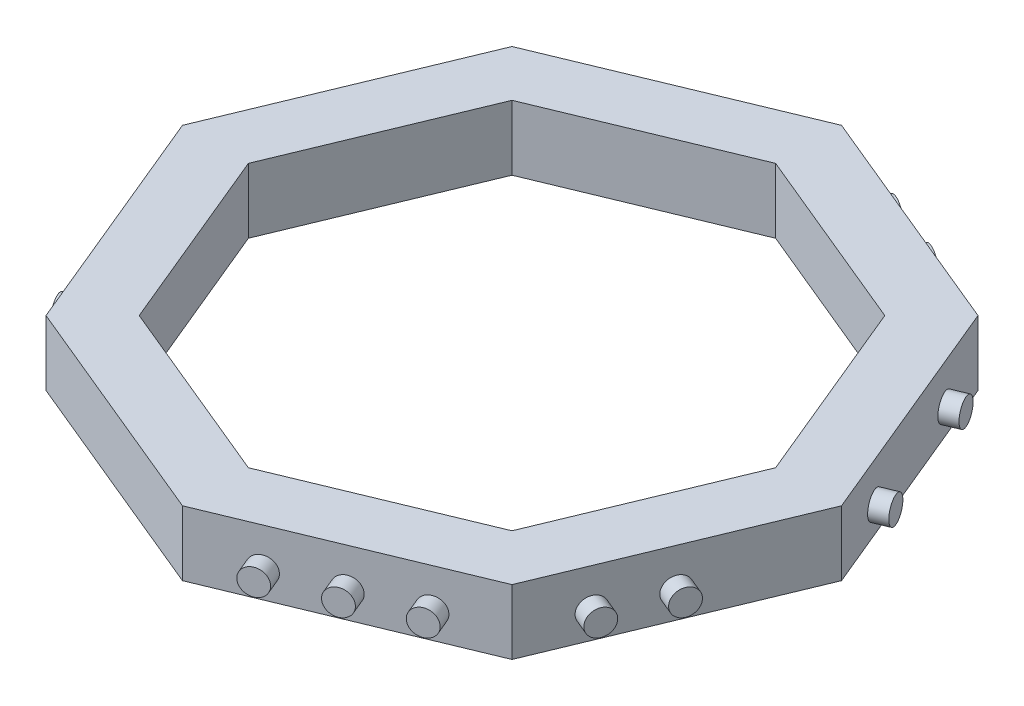
ISO-10303-21;
HEADER;
FILE_DESCRIPTION(('STEP AP214'),'2;1');
FILE_NAME('part.step','',(''),(''),'','','');
FILE_SCHEMA(('AUTOMOTIVE_DESIGN { 1 0 10303 214 1 1 1 1 }'));
ENDSEC;
DATA;
#1=APPLICATION_CONTEXT('core data for automotive mechanical design processes');
#2=APPLICATION_PROTOCOL_DEFINITION('international standard','automotive_design',2000,#1);
#3=PRODUCT_CONTEXT('',#1,'mechanical');
#4=PRODUCT('Part','Part','',(#3));
#5=PRODUCT_RELATED_PRODUCT_CATEGORY('part','',(#4));
#6=PRODUCT_DEFINITION_FORMATION('','',#4);
#7=PRODUCT_DEFINITION_CONTEXT('part definition',#1,'design');
#8=PRODUCT_DEFINITION('design','',#6,#7);
#9=PRODUCT_DEFINITION_SHAPE('','',#8);
#10=(LENGTH_UNIT() NAMED_UNIT(*) SI_UNIT(.MILLI.,.METRE.));
#11=(NAMED_UNIT(*) PLANE_ANGLE_UNIT() SI_UNIT($,.RADIAN.));
#12=(NAMED_UNIT(*) SI_UNIT($,.STERADIAN.) SOLID_ANGLE_UNIT());
#13=UNCERTAINTY_MEASURE_WITH_UNIT(LENGTH_MEASURE(1.E-05),#10,'distance_accuracy_value','');
#14=(GEOMETRIC_REPRESENTATION_CONTEXT(3) GLOBAL_UNCERTAINTY_ASSIGNED_CONTEXT((#13)) GLOBAL_UNIT_ASSIGNED_CONTEXT((#10,
#11,#12)) REPRESENTATION_CONTEXT('',''));
#15=CARTESIAN_POINT('',(0.,0.,0.));
#16=DIRECTION('',(0.,0.,1.));
#17=DIRECTION('',(1.,0.,0.));
#18=AXIS2_PLACEMENT_3D('',#15,#16,#17);
#19=CARTESIAN_POINT('',(17.9605122421385,5.,17.9605122421381));
#20=DIRECTION('',(-0.923879532511291,0.,-0.38268343236508));
#21=DIRECTION('',(-0.38268343236508,0.,0.923879532511291));
#22=AXIS2_PLACEMENT_3D('',#19,#20,#21);
#23=PLANE('',#22);
#24=CARTESIAN_POINT('',(21.6802561210693,2.,8.98025612106892));
#25=DIRECTION('',(-0.923879532511291,0.,-0.38268343236508));
#26=DIRECTION('',(-0.38268343236508,0.,0.923879532511291));
#27=AXIS2_PLACEMENT_3D('',#24,#25,#26);
#28=CIRCLE('',#27,1.);
#29=CARTESIAN_POINT('',(21.2975726887042,2.,9.90413565358022));
#30=VERTEX_POINT('',#29);
#31=EDGE_CURVE('E11',#30,#30,#28,.F.);
#32=ORIENTED_EDGE('',*,*,#31,.F.);
#33=EDGE_LOOP('',(#32));
#34=FACE_BOUND('',#33,.T.);
#35=CARTESIAN_POINT('',(19.7668389592439,2.,13.5996537836254));
#36=DIRECTION('',(-0.923879532511291,0.,-0.38268343236508));
#37=DIRECTION('',(-0.38268343236508,0.,0.923879532511291));
#38=AXIS2_PLACEMENT_3D('',#35,#36,#37);
#39=CIRCLE('',#38,1.);
#40=CARTESIAN_POINT('',(19.3841555268788,2.,14.5235333161367));
#41=VERTEX_POINT('',#40);
#42=EDGE_CURVE('E40',#41,#41,#39,.F.);
#43=ORIENTED_EDGE('',*,*,#42,.F.);
#44=EDGE_LOOP('',(#43));
#45=FACE_BOUND('',#44,.T.);
#46=DIRECTION('',(0.38268343236508,0.,-0.923879532511291));
#47=VECTOR('',#46,1.);
#48=CARTESIAN_POINT('',(17.9605122421385,0.,17.9605122421381));
#49=LINE('',#48,#47);
#50=CARTESIAN_POINT('',(17.9605122421385,0.,17.9605122421381));
#51=VERTEX_POINT('',#50);
#52=CARTESIAN_POINT('',(25.4,0.,-2.74086309204336E-13));
#53=VERTEX_POINT('',#52);
#54=EDGE_CURVE('E205',#51,#53,#49,.T.);
#55=ORIENTED_EDGE('',*,*,#54,.T.);
#56=DIRECTION('',(0.,-1.,0.));
#57=VECTOR('',#56,1.);
#58=CARTESIAN_POINT('',(25.4,5.,-2.74086309204336E-13));
#59=LINE('',#58,#57);
#60=CARTESIAN_POINT('',(25.4,5.,-2.74086309204336E-13));
#61=VERTEX_POINT('',#60);
#62=EDGE_CURVE('E271',#61,#53,#59,.T.);
#63=ORIENTED_EDGE('',*,*,#62,.F.);
#64=DIRECTION('',(0.38268343236508,0.,-0.923879532511291));
#65=VECTOR('',#64,1.);
#66=CARTESIAN_POINT('',(17.9605122421385,5.,17.9605122421381));
#67=LINE('',#66,#65);
#68=CARTESIAN_POINT('',(17.9605122421385,5.,17.9605122421381));
#69=VERTEX_POINT('',#68);
#70=EDGE_CURVE('E217',#69,#61,#67,.T.);
#71=ORIENTED_EDGE('',*,*,#70,.F.);
#72=DIRECTION('',(0.,-1.,0.));
#73=VECTOR('',#72,1.);
#74=CARTESIAN_POINT('',(17.9605122421385,5.,17.9605122421381));
#75=LINE('',#74,#73);
#76=EDGE_CURVE('E235',#69,#51,#75,.T.);
#77=ORIENTED_EDGE('',*,*,#76,.T.);
#78=EDGE_LOOP('',(#55,#63,#71,#77));
#79=FACE_BOUND('',#78,.T.);
#80=ADVANCED_FACE('F33',(#34,#45,#79),#23,.F.);
#81=CARTESIAN_POINT('',(25.4,5.,-2.74086309204336E-13));
#82=DIRECTION('',(-0.923879532511283,0.,0.3826834323651));
#83=DIRECTION('',(0.3826834323651,0.,0.923879532511283));
#84=AXIS2_PLACEMENT_3D('',#81,#82,#83);
#85=PLANE('',#84);
#86=CARTESIAN_POINT('',(19.7668389592436,2.,-13.5996537836258));
#87=DIRECTION('',(-0.923879532511283,0.,0.3826834323651));
#88=DIRECTION('',(0.3826834323651,0.,0.923879532511283));
#89=AXIS2_PLACEMENT_3D('',#86,#87,#88);
#90=CIRCLE('',#89,1.);
#91=CARTESIAN_POINT('',(20.1495223916087,2.,-12.6757742511145));
#92=VERTEX_POINT('',#91);
#93=EDGE_CURVE('E301',#92,#92,#90,.F.);
#94=ORIENTED_EDGE('',*,*,#93,.F.);
#95=EDGE_LOOP('',(#94));
#96=FACE_BOUND('',#95,.T.);
#97=CARTESIAN_POINT('',(23.5936732828946,2.,-4.36085845851299));
#98=DIRECTION('',(-0.923879532511283,0.,0.3826834323651));
#99=DIRECTION('',(0.3826834323651,0.,0.923879532511283));
#100=AXIS2_PLACEMENT_3D('',#97,#98,#99);
#101=CIRCLE('',#100,1.);
#102=CARTESIAN_POINT('',(23.9763567152597,2.,-3.43697892600171));
#103=VERTEX_POINT('',#102);
#104=EDGE_CURVE('E298',#103,#103,#101,.F.);
#105=ORIENTED_EDGE('',*,*,#104,.F.);
#106=EDGE_LOOP('',(#105));
#107=FACE_BOUND('',#106,.T.);
#108=DIRECTION('',(-0.3826834323651,0.,-0.923879532511283));
#109=VECTOR('',#108,1.);
#110=CARTESIAN_POINT('',(25.4,0.,-2.74086309204336E-13));
#111=LINE('',#110,#109);
#112=CARTESIAN_POINT('',(17.9605122421381,0.,-17.9605122421385));
#113=VERTEX_POINT('',#112);
#114=EDGE_CURVE('E238',#53,#113,#111,.T.);
#115=ORIENTED_EDGE('',*,*,#114,.T.);
#116=DIRECTION('',(0.,-1.,0.));
#117=VECTOR('',#116,1.);
#118=CARTESIAN_POINT('',(17.9605122421381,5.,-17.9605122421385));
#119=LINE('',#118,#117);
#120=CARTESIAN_POINT('',(17.9605122421381,5.,-17.9605122421385));
#121=VERTEX_POINT('',#120);
#122=EDGE_CURVE('E268',#121,#113,#119,.T.);
#123=ORIENTED_EDGE('',*,*,#122,.F.);
#124=DIRECTION('',(-0.3826834323651,0.,-0.923879532511283));
#125=VECTOR('',#124,1.);
#126=CARTESIAN_POINT('',(25.4,5.,-2.74086309204336E-13));
#127=LINE('',#126,#125);
#128=EDGE_CURVE('E220',#61,#121,#127,.T.);
#129=ORIENTED_EDGE('',*,*,#128,.F.);
#130=ORIENTED_EDGE('',*,*,#62,.T.);
#131=EDGE_LOOP('',(#115,#123,#129,#130));
#132=FACE_BOUND('',#131,.T.);
#133=ADVANCED_FACE('F310',(#96,#107,#132),#85,.F.);
#134=CARTESIAN_POINT('',(17.9605122421381,5.,-17.9605122421385));
#135=DIRECTION('',(-0.38268343236508,0.,0.923879532511291));
#136=DIRECTION('',(0.923879532511291,0.,0.38268343236508));
#137=AXIS2_PLACEMENT_3D('',#134,#135,#136);
#138=PLANE('',#137);
#139=CARTESIAN_POINT('',(4.36085845851247,2.,-23.5936732828947));
#140=DIRECTION('',(-0.38268343236508,0.,0.923879532511291));
#141=DIRECTION('',(0.923879532511291,0.,0.38268343236508));
#142=AXIS2_PLACEMENT_3D('',#139,#140,#141);
#143=CIRCLE('',#142,1.);
#144=CARTESIAN_POINT('',(5.28473799102376,2.,-23.2109898505296));
#145=VERTEX_POINT('',#144);
#146=EDGE_CURVE('E295',#145,#145,#143,.F.);
#147=ORIENTED_EDGE('',*,*,#146,.F.);
#148=EDGE_LOOP('',(#147));
#149=FACE_BOUND('',#148,.T.);
#150=CARTESIAN_POINT('',(8.98025612106893,2.,-21.6802561210693));
#151=DIRECTION('',(-0.38268343236508,0.,0.923879532511291));
#152=DIRECTION('',(0.923879532511291,0.,0.38268343236508));
#153=AXIS2_PLACEMENT_3D('',#150,#151,#152);
#154=CIRCLE('',#153,1.);
#155=CARTESIAN_POINT('',(9.90413565358022,2.,-21.2975726887042));
#156=VERTEX_POINT('',#155);
#157=EDGE_CURVE('E292',#156,#156,#154,.F.);
#158=ORIENTED_EDGE('',*,*,#157,.F.);
#159=EDGE_LOOP('',(#158));
#160=FACE_BOUND('',#159,.T.);
#161=DIRECTION('',(-0.923879532511291,0.,-0.38268343236508));
#162=VECTOR('',#161,1.);
#163=CARTESIAN_POINT('',(17.9605122421381,0.,-17.9605122421385));
#164=LINE('',#163,#162);
#165=CARTESIAN_POINT('',(-2.91433543964104E-13,0.,-25.4));
#166=VERTEX_POINT('',#165);
#167=EDGE_CURVE('E240',#113,#166,#164,.T.);
#168=ORIENTED_EDGE('',*,*,#167,.T.);
#169=DIRECTION('',(0.,-1.,0.));
#170=VECTOR('',#169,1.);
#171=CARTESIAN_POINT('',(-2.91433543964104E-13,5.,-25.4));
#172=LINE('',#171,#170);
#173=CARTESIAN_POINT('',(-2.91433543964104E-13,5.,-25.4));
#174=VERTEX_POINT('',#173);
#175=EDGE_CURVE('E265',#174,#166,#172,.T.);
#176=ORIENTED_EDGE('',*,*,#175,.F.);
#177=DIRECTION('',(-0.923879532511291,0.,-0.38268343236508));
#178=VECTOR('',#177,1.);
#179=CARTESIAN_POINT('',(17.9605122421381,5.,-17.9605122421385));
#180=LINE('',#179,#178);
#181=EDGE_CURVE('E223',#121,#174,#180,.T.);
#182=ORIENTED_EDGE('',*,*,#181,.F.);
#183=ORIENTED_EDGE('',*,*,#122,.T.);
#184=EDGE_LOOP('',(#168,#176,#182,#183));
#185=FACE_BOUND('',#184,.T.);
#186=ADVANCED_FACE('F348',(#149,#160,#185),#138,.F.);
#187=CARTESIAN_POINT('',(-2.91433543964104E-13,5.,-25.4));
#188=DIRECTION('',(0.3826834323651,0.,0.923879532511283));
#189=DIRECTION('',(0.923879532511283,0.,-0.3826834323651));
#190=AXIS2_PLACEMENT_3D('',#187,#188,#189);
#191=PLANE('',#190);
#192=CARTESIAN_POINT('',(-4.36085845851299,2.,-23.5936732828946));
#193=DIRECTION('',(0.3826834323651,0.,0.923879532511283));
#194=DIRECTION('',(0.923879532511283,0.,-0.3826834323651));
#195=AXIS2_PLACEMENT_3D('',#192,#193,#194);
#196=CIRCLE('',#195,1.);
#197=CARTESIAN_POINT('',(-3.43697892600171,2.,-23.9763567152597));
#198=VERTEX_POINT('',#197);
#199=EDGE_CURVE('E289',#198,#198,#196,.F.);
#200=ORIENTED_EDGE('',*,*,#199,.F.);
#201=EDGE_LOOP('',(#200));
#202=FACE_BOUND('',#201,.T.);
#203=DIRECTION('',(-0.923879532511283,0.,0.3826834323651));
#204=VECTOR('',#203,1.);
#205=CARTESIAN_POINT('',(-2.91433543964104E-13,0.,-25.4));
#206=LINE('',#205,#204);
#207=CARTESIAN_POINT('',(-17.9605122421385,0.,-17.9605122421381));
#208=VERTEX_POINT('',#207);
#209=EDGE_CURVE('E242',#166,#208,#206,.T.);
#210=ORIENTED_EDGE('',*,*,#209,.T.);
#211=DIRECTION('',(0.,-1.,0.));
#212=VECTOR('',#211,1.);
#213=CARTESIAN_POINT('',(-17.9605122421385,5.,-17.9605122421381));
#214=LINE('',#213,#212);
#215=CARTESIAN_POINT('',(-17.9605122421385,5.,-17.9605122421381));
#216=VERTEX_POINT('',#215);
#217=EDGE_CURVE('E262',#216,#208,#214,.T.);
#218=ORIENTED_EDGE('',*,*,#217,.F.);
#219=DIRECTION('',(-0.923879532511283,0.,0.3826834323651));
#220=VECTOR('',#219,1.);
#221=CARTESIAN_POINT('',(-2.91433543964104E-13,5.,-25.4));
#222=LINE('',#221,#220);
#223=EDGE_CURVE('E225',#174,#216,#222,.T.);
#224=ORIENTED_EDGE('',*,*,#223,.F.);
#225=ORIENTED_EDGE('',*,*,#175,.T.);
#226=EDGE_LOOP('',(#210,#218,#224,#225));
#227=FACE_BOUND('',#226,.T.);
#228=ADVANCED_FACE('F345',(#202,#227),#191,.F.);
#229=CARTESIAN_POINT('',(-17.9605122421385,5.,-17.9605122421381));
#230=DIRECTION('',(0.923879532511291,0.,0.382683432365079));
#231=DIRECTION('',(0.382683432365079,0.,-0.923879532511291));
#232=AXIS2_PLACEMENT_3D('',#229,#230,#231);
#233=PLANE('',#232);
#234=CARTESIAN_POINT('',(-21.6802561210693,2.,-8.98025612106892));
#235=DIRECTION('',(0.923879532511291,0.,0.382683432365079));
#236=DIRECTION('',(0.382683432365079,0.,-0.923879532511291));
#237=AXIS2_PLACEMENT_3D('',#234,#235,#236);
#238=CIRCLE('',#237,1.);
#239=CARTESIAN_POINT('',(-21.2975726887042,2.,-9.90413565358021));
#240=VERTEX_POINT('',#239);
#241=EDGE_CURVE('E286',#240,#240,#238,.F.);
#242=ORIENTED_EDGE('',*,*,#241,.F.);
#243=EDGE_LOOP('',(#242));
#244=FACE_BOUND('',#243,.T.);
#245=DIRECTION('',(-0.38268343236508,0.,0.923879532511291));
#246=VECTOR('',#245,1.);
#247=CARTESIAN_POINT('',(-17.9605122421385,0.,-17.9605122421381));
#248=LINE('',#247,#246);
#249=CARTESIAN_POINT('',(-25.4,0.,2.77555756156289E-13));
#250=VERTEX_POINT('',#249);
#251=EDGE_CURVE('E244',#208,#250,#248,.T.);
#252=ORIENTED_EDGE('',*,*,#251,.T.);
#253=DIRECTION('',(0.,-1.,0.));
#254=VECTOR('',#253,1.);
#255=CARTESIAN_POINT('',(-25.4,5.,2.77555756156289E-13));
#256=LINE('',#255,#254);
#257=CARTESIAN_POINT('',(-25.4,5.,2.77555756156289E-13));
#258=VERTEX_POINT('',#257);
#259=EDGE_CURVE('E259',#258,#250,#256,.T.);
#260=ORIENTED_EDGE('',*,*,#259,.F.);
#261=DIRECTION('',(-0.38268343236508,0.,0.923879532511291));
#262=VECTOR('',#261,1.);
#263=CARTESIAN_POINT('',(-17.9605122421385,5.,-17.9605122421381));
#264=LINE('',#263,#262);
#265=EDGE_CURVE('E227',#216,#258,#264,.T.);
#266=ORIENTED_EDGE('',*,*,#265,.F.);
#267=ORIENTED_EDGE('',*,*,#217,.T.);
#268=EDGE_LOOP('',(#252,#260,#266,#267));
#269=FACE_BOUND('',#268,.T.);
#270=ADVANCED_FACE('F341',(#244,#269),#233,.F.);
#271=CARTESIAN_POINT('',(-25.4,5.,2.77555756156289E-13));
#272=DIRECTION('',(0.923879532511283,0.,-0.3826834323651));
#273=DIRECTION('',(-0.3826834323651,0.,-0.923879532511283));
#274=AXIS2_PLACEMENT_3D('',#271,#272,#273);
#275=PLANE('',#274);
#276=CARTESIAN_POINT('',(-19.7668389592436,2.,13.5996537836258));
#277=DIRECTION('',(0.923879532511283,0.,-0.3826834323651));
#278=DIRECTION('',(-0.3826834323651,0.,-0.923879532511283));
#279=AXIS2_PLACEMENT_3D('',#276,#277,#278);
#280=CIRCLE('',#279,1.);
#281=CARTESIAN_POINT('',(-20.1495223916087,2.,12.6757742511145));
#282=VERTEX_POINT('',#281);
#283=EDGE_CURVE('E283',#282,#282,#280,.F.);
#284=ORIENTED_EDGE('',*,*,#283,.F.);
#285=EDGE_LOOP('',(#284));
#286=FACE_BOUND('',#285,.T.);
#287=DIRECTION('',(0.3826834323651,0.,0.923879532511283));
#288=VECTOR('',#287,1.);
#289=CARTESIAN_POINT('',(-25.4,0.,2.77555756156289E-13));
#290=LINE('',#289,#288);
#291=CARTESIAN_POINT('',(-17.9605122421381,0.,17.9605122421385));
#292=VERTEX_POINT('',#291);
#293=EDGE_CURVE('E246',#250,#292,#290,.T.);
#294=ORIENTED_EDGE('',*,*,#293,.T.);
#295=DIRECTION('',(0.,-1.,0.));
#296=VECTOR('',#295,1.);
#297=CARTESIAN_POINT('',(-17.9605122421381,5.,17.9605122421385));
#298=LINE('',#297,#296);
#299=CARTESIAN_POINT('',(-17.9605122421381,5.,17.9605122421385));
#300=VERTEX_POINT('',#299);
#301=EDGE_CURVE('E256',#300,#292,#298,.T.);
#302=ORIENTED_EDGE('',*,*,#301,.F.);
#303=DIRECTION('',(0.3826834323651,0.,0.923879532511283));
#304=VECTOR('',#303,1.);
#305=CARTESIAN_POINT('',(-25.4,5.,2.77555756156289E-13));
#306=LINE('',#305,#304);
#307=EDGE_CURVE('E229',#258,#300,#306,.T.);
#308=ORIENTED_EDGE('',*,*,#307,.F.);
#309=ORIENTED_EDGE('',*,*,#259,.T.);
#310=EDGE_LOOP('',(#294,#302,#308,#309));
#311=FACE_BOUND('',#310,.T.);
#312=ADVANCED_FACE('F336',(#286,#311),#275,.F.);
#313=CARTESIAN_POINT('',(-17.9605122421381,5.,17.9605122421385));
#314=DIRECTION('',(0.38268343236508,0.,-0.923879532511291));
#315=DIRECTION('',(-0.923879532511291,0.,-0.38268343236508));
#316=AXIS2_PLACEMENT_3D('',#313,#314,#315);
#317=PLANE('',#316);
#318=DIRECTION('',(0.923879532511291,0.,0.38268343236508));
#319=VECTOR('',#318,1.);
#320=CARTESIAN_POINT('',(-17.9605122421381,0.,17.9605122421385));
#321=LINE('',#320,#319);
#322=CARTESIAN_POINT('',(2.77555756156289E-13,0.,25.4));
#323=VERTEX_POINT('',#322);
#324=EDGE_CURVE('E248',#292,#323,#321,.T.);
#325=ORIENTED_EDGE('',*,*,#324,.T.);
#326=DIRECTION('',(0.,-1.,0.));
#327=VECTOR('',#326,1.);
#328=CARTESIAN_POINT('',(2.77555756156289E-13,5.,25.4));
#329=LINE('',#328,#327);
#330=CARTESIAN_POINT('',(2.77555756156289E-13,5.,25.4));
#331=VERTEX_POINT('',#330);
#332=EDGE_CURVE('E253',#331,#323,#329,.T.);
#333=ORIENTED_EDGE('',*,*,#332,.F.);
#334=DIRECTION('',(0.923879532511291,0.,0.38268343236508));
#335=VECTOR('',#334,1.);
#336=CARTESIAN_POINT('',(-17.9605122421381,5.,17.9605122421385));
#337=LINE('',#336,#335);
#338=EDGE_CURVE('E231',#300,#331,#337,.T.);
#339=ORIENTED_EDGE('',*,*,#338,.F.);
#340=ORIENTED_EDGE('',*,*,#301,.T.);
#341=EDGE_LOOP('',(#325,#333,#339,#340));
#342=FACE_BOUND('',#341,.T.);
#343=ADVANCED_FACE('F331',(#342),#317,.F.);
#344=CARTESIAN_POINT('',(2.77555756156289E-13,5.,25.4));
#345=DIRECTION('',(-0.3826834323651,0.,-0.923879532511283));
#346=DIRECTION('',(-0.923879532511283,0.,0.3826834323651));
#347=AXIS2_PLACEMENT_3D('',#344,#345,#346);
#348=PLANE('',#347);
#349=CARTESIAN_POINT('',(8.98025612106939,2.,21.6802561210691));
#350=DIRECTION('',(-0.3826834323651,0.,-0.923879532511283));
#351=DIRECTION('',(-0.923879532511283,0.,0.3826834323651));
#352=AXIS2_PLACEMENT_3D('',#349,#350,#351);
#353=CIRCLE('',#352,1.);
#354=CARTESIAN_POINT('',(8.05637658855811,2.,22.0629395534342));
#355=VERTEX_POINT('',#354);
#356=EDGE_CURVE('E280',#355,#355,#353,.F.);
#357=ORIENTED_EDGE('',*,*,#356,.F.);
#358=EDGE_LOOP('',(#357));
#359=FACE_BOUND('',#358,.T.);
#360=CARTESIAN_POINT('',(4.36085845851298,2.,23.5936732828946));
#361=DIRECTION('',(-0.3826834323651,0.,-0.923879532511283));
#362=DIRECTION('',(-0.923879532511283,0.,0.3826834323651));
#363=AXIS2_PLACEMENT_3D('',#360,#361,#362);
#364=CIRCLE('',#363,1.);
#365=CARTESIAN_POINT('',(3.4369789260017,2.,23.9763567152597));
#366=VERTEX_POINT('',#365);
#367=EDGE_CURVE('E277',#366,#366,#364,.F.);
#368=ORIENTED_EDGE('',*,*,#367,.F.);
#369=EDGE_LOOP('',(#368));
#370=FACE_BOUND('',#369,.T.);
#371=CARTESIAN_POINT('',(13.5996537836258,2.,19.7668389592436));
#372=DIRECTION('',(-0.3826834323651,0.,-0.923879532511283));
#373=DIRECTION('',(-0.923879532511283,0.,0.3826834323651));
#374=AXIS2_PLACEMENT_3D('',#371,#372,#373);
#375=CIRCLE('',#374,0.999999999999998);
#376=CARTESIAN_POINT('',(12.6757742511145,2.,20.1495223916087));
#377=VERTEX_POINT('',#376);
#378=EDGE_CURVE('E274',#377,#377,#375,.F.);
#379=ORIENTED_EDGE('',*,*,#378,.F.);
#380=EDGE_LOOP('',(#379));
#381=FACE_BOUND('',#380,.T.);
#382=DIRECTION('',(0.923879532511283,0.,-0.3826834323651));
#383=VECTOR('',#382,1.);
#384=CARTESIAN_POINT('',(2.77555756156289E-13,0.,25.4));
#385=LINE('',#384,#383);
#386=EDGE_CURVE('E221',#323,#51,#385,.T.);
#387=ORIENTED_EDGE('',*,*,#386,.T.);
#388=ORIENTED_EDGE('',*,*,#76,.F.);
#389=DIRECTION('',(0.923879532511283,0.,-0.3826834323651));
#390=VECTOR('',#389,1.);
#391=CARTESIAN_POINT('',(2.77555756156289E-13,5.,25.4));
#392=LINE('',#391,#390);
#393=EDGE_CURVE('E233',#331,#69,#392,.T.);
#394=ORIENTED_EDGE('',*,*,#393,.F.);
#395=ORIENTED_EDGE('',*,*,#332,.T.);
#396=EDGE_LOOP('',(#387,#388,#394,#395));
#397=FACE_BOUND('',#396,.T.);
#398=ADVANCED_FACE('F329',(#359,#370,#381,#397),#348,.F.);
#399=CARTESIAN_POINT('',(0.,5.,0.));
#400=DIRECTION('',(0.,1.,0.));
#401=DIRECTION('',(0.,0.,1.));
#402=AXIS2_PLACEMENT_3D('',#399,#400,#401);
#403=PLANE('',#402);
#404=DIRECTION('',(0.382683432365079,0.,-0.923879532511291));
#405=VECTOR('',#404,1.);
#406=CARTESIAN_POINT('',(14.3684097937108,5.,14.3684097937105));
#407=LINE('',#406,#405);
#408=CARTESIAN_POINT('',(14.3684097937108,5.,14.3684097937105));
#409=VERTEX_POINT('',#408);
#410=CARTESIAN_POINT('',(20.32,5.,-2.38524477946811E-13));
#411=VERTEX_POINT('',#410);
#412=EDGE_CURVE('E47',#409,#411,#407,.T.);
#413=ORIENTED_EDGE('',*,*,#412,.F.);
#414=DIRECTION('',(0.923879532511282,0.,-0.3826834323651));
#415=VECTOR('',#414,1.);
#416=CARTESIAN_POINT('',(2.40678638717616E-13,5.,20.32));
#417=LINE('',#416,#415);
#418=CARTESIAN_POINT('',(2.40678638717616E-13,5.,20.32));
#419=VERTEX_POINT('',#418);
#420=EDGE_CURVE('E164',#419,#409,#417,.T.);
#421=ORIENTED_EDGE('',*,*,#420,.F.);
#422=DIRECTION('',(0.923879532511291,0.,0.382683432365079));
#423=VECTOR('',#422,1.);
#424=CARTESIAN_POINT('',(-14.3684097937105,5.,14.3684097937108));
#425=LINE('',#424,#423);
#426=CARTESIAN_POINT('',(-14.3684097937105,5.,14.3684097937108));
#427=VERTEX_POINT('',#426);
#428=EDGE_CURVE('E167',#427,#419,#425,.T.);
#429=ORIENTED_EDGE('',*,*,#428,.F.);
#430=DIRECTION('',(0.3826834323651,0.,0.923879532511282));
#431=VECTOR('',#430,1.);
#432=CARTESIAN_POINT('',(-20.32,5.,2.42729561305328E-13));
#433=LINE('',#432,#431);
#434=CARTESIAN_POINT('',(-20.32,5.,2.42729561305328E-13));
#435=VERTEX_POINT('',#434);
#436=EDGE_CURVE('E198',#435,#427,#433,.T.);
#437=ORIENTED_EDGE('',*,*,#436,.F.);
#438=DIRECTION('',(-0.382683432365079,0.,0.923879532511291));
#439=VECTOR('',#438,1.);
#440=CARTESIAN_POINT('',(-14.3684097937108,5.,-14.3684097937105));
#441=LINE('',#440,#439);
#442=CARTESIAN_POINT('',(-14.3684097937108,5.,-14.3684097937105));
#443=VERTEX_POINT('',#442);
#444=EDGE_CURVE('E195',#443,#435,#441,.T.);
#445=ORIENTED_EDGE('',*,*,#444,.F.);
#446=DIRECTION('',(-0.923879532511282,0.,0.3826834323651));
#447=VECTOR('',#446,1.);
#448=CARTESIAN_POINT('',(-2.42838850685979E-13,5.,-20.32));
#449=LINE('',#448,#447);
#450=CARTESIAN_POINT('',(-2.42838850685979E-13,5.,-20.32));
#451=VERTEX_POINT('',#450);
#452=EDGE_CURVE('E192',#451,#443,#449,.T.);
#453=ORIENTED_EDGE('',*,*,#452,.F.);
#454=DIRECTION('',(-0.923879532511291,0.,-0.382683432365079));
#455=VECTOR('',#454,1.);
#456=CARTESIAN_POINT('',(14.3684097937105,5.,-14.3684097937108));
#457=LINE('',#456,#455);
#458=CARTESIAN_POINT('',(14.3684097937105,5.,-14.3684097937108));
#459=VERTEX_POINT('',#458);
#460=EDGE_CURVE('E189',#459,#451,#457,.T.);
#461=ORIENTED_EDGE('',*,*,#460,.F.);
#462=DIRECTION('',(-0.382683432365101,0.,-0.923879532511282));
#463=VECTOR('',#462,1.);
#464=CARTESIAN_POINT('',(20.32,5.,-2.3879865158925E-13));
#465=LINE('',#464,#463);
#466=EDGE_CURVE('E187',#411,#459,#465,.T.);
#467=ORIENTED_EDGE('',*,*,#466,.F.);
#468=EDGE_LOOP('',(#413,#421,#429,#437,#445,#453,#461,#467));
#469=FACE_BOUND('',#468,.T.);
#470=ORIENTED_EDGE('',*,*,#70,.T.);
#471=ORIENTED_EDGE('',*,*,#128,.T.);
#472=ORIENTED_EDGE('',*,*,#181,.T.);
#473=ORIENTED_EDGE('',*,*,#223,.T.);
#474=ORIENTED_EDGE('',*,*,#265,.T.);
#475=ORIENTED_EDGE('',*,*,#307,.T.);
#476=ORIENTED_EDGE('',*,*,#338,.T.);
#477=ORIENTED_EDGE('',*,*,#393,.T.);
#478=EDGE_LOOP('',(#470,#471,#472,#473,#474,#475,#476,#477));
#479=FACE_BOUND('',#478,.T.);
#480=ADVANCED_FACE('F324',(#469,#479),#403,.T.);
#481=CARTESIAN_POINT('',(0.,0.,0.));
#482=DIRECTION('',(0.,1.,0.));
#483=DIRECTION('',(0.,0.,1.));
#484=AXIS2_PLACEMENT_3D('',#481,#482,#483);
#485=PLANE('',#484);
#486=DIRECTION('',(0.923879532511282,0.,-0.3826834323651));
#487=VECTOR('',#486,1.);
#488=CARTESIAN_POINT('',(2.40678638717616E-13,0.,20.32));
#489=LINE('',#488,#487);
#490=CARTESIAN_POINT('',(2.40678638717616E-13,0.,20.32));
#491=VERTEX_POINT('',#490);
#492=CARTESIAN_POINT('',(14.3684097937108,0.,14.3684097937105));
#493=VERTEX_POINT('',#492);
#494=EDGE_CURVE('E153',#491,#493,#489,.T.);
#495=ORIENTED_EDGE('',*,*,#494,.T.);
#496=DIRECTION('',(0.382683432365079,0.,-0.923879532511291));
#497=VECTOR('',#496,1.);
#498=CARTESIAN_POINT('',(14.3684097937108,0.,14.3684097937105));
#499=LINE('',#498,#497);
#500=CARTESIAN_POINT('',(20.32,0.,-2.3879865158925E-13));
#501=VERTEX_POINT('',#500);
#502=EDGE_CURVE('E147',#493,#501,#499,.T.);
#503=ORIENTED_EDGE('',*,*,#502,.T.);
#504=DIRECTION('',(-0.382683432365101,0.,-0.923879532511282));
#505=VECTOR('',#504,1.);
#506=CARTESIAN_POINT('',(20.32,0.,-2.3879865158925E-13));
#507=LINE('',#506,#505);
#508=CARTESIAN_POINT('',(14.3684097937105,0.,-14.3684097937108));
#509=VERTEX_POINT('',#508);
#510=EDGE_CURVE('E156',#501,#509,#507,.T.);
#511=ORIENTED_EDGE('',*,*,#510,.T.);
#512=DIRECTION('',(-0.923879532511291,0.,-0.382683432365079));
#513=VECTOR('',#512,1.);
#514=CARTESIAN_POINT('',(14.3684097937105,0.,-14.3684097937108));
#515=LINE('',#514,#513);
#516=CARTESIAN_POINT('',(-2.42838850685979E-13,0.,-20.32));
#517=VERTEX_POINT('',#516);
#518=EDGE_CURVE('E55',#509,#517,#515,.T.);
#519=ORIENTED_EDGE('',*,*,#518,.T.);
#520=DIRECTION('',(-0.923879532511282,0.,0.3826834323651));
#521=VECTOR('',#520,1.);
#522=CARTESIAN_POINT('',(-2.42838850685979E-13,0.,-20.32));
#523=LINE('',#522,#521);
#524=CARTESIAN_POINT('',(-14.3684097937108,0.,-14.3684097937105));
#525=VERTEX_POINT('',#524);
#526=EDGE_CURVE('E174',#517,#525,#523,.T.);
#527=ORIENTED_EDGE('',*,*,#526,.T.);
#528=DIRECTION('',(-0.382683432365079,0.,0.923879532511291));
#529=VECTOR('',#528,1.);
#530=CARTESIAN_POINT('',(-14.3684097937108,0.,-14.3684097937105));
#531=LINE('',#530,#529);
#532=CARTESIAN_POINT('',(-20.32,0.,2.42729561305328E-13));
#533=VERTEX_POINT('',#532);
#534=EDGE_CURVE('E177',#525,#533,#531,.T.);
#535=ORIENTED_EDGE('',*,*,#534,.T.);
#536=DIRECTION('',(0.3826834323651,0.,0.923879532511282));
#537=VECTOR('',#536,1.);
#538=CARTESIAN_POINT('',(-20.32,0.,2.42729561305328E-13));
#539=LINE('',#538,#537);
#540=CARTESIAN_POINT('',(-14.3684097937105,0.,14.3684097937108));
#541=VERTEX_POINT('',#540);
#542=EDGE_CURVE('E180',#533,#541,#539,.T.);
#543=ORIENTED_EDGE('',*,*,#542,.T.);
#544=DIRECTION('',(0.923879532511291,0.,0.382683432365079));
#545=VECTOR('',#544,1.);
#546=CARTESIAN_POINT('',(-14.3684097937105,0.,14.3684097937108));
#547=LINE('',#546,#545);
#548=EDGE_CURVE('E183',#541,#491,#547,.T.);
#549=ORIENTED_EDGE('',*,*,#548,.T.);
#550=EDGE_LOOP('',(#495,#503,#511,#519,#527,#535,#543,#549));
#551=FACE_BOUND('',#550,.T.);
#552=ORIENTED_EDGE('',*,*,#54,.F.);
#553=ORIENTED_EDGE('',*,*,#386,.F.);
#554=ORIENTED_EDGE('',*,*,#324,.F.);
#555=ORIENTED_EDGE('',*,*,#293,.F.);
#556=ORIENTED_EDGE('',*,*,#251,.F.);
#557=ORIENTED_EDGE('',*,*,#209,.F.);
#558=ORIENTED_EDGE('',*,*,#167,.F.);
#559=ORIENTED_EDGE('',*,*,#114,.F.);
#560=EDGE_LOOP('',(#552,#553,#554,#555,#556,#557,#558,#559));
#561=FACE_BOUND('',#560,.T.);
#562=ADVANCED_FACE('F160',(#551,#561),#485,.F.);
#563=CARTESIAN_POINT('',(14.3684097937108,0.,14.3684097937105));
#564=DIRECTION('',(0.923879532511291,0.,0.382683432365079));
#565=DIRECTION('',(0.382683432365079,0.,-0.923879532511291));
#566=AXIS2_PLACEMENT_3D('',#563,#564,#565);
#567=PLANE('',#566);
#568=ORIENTED_EDGE('',*,*,#412,.T.);
#569=DIRECTION('',(0.,1.,0.));
#570=VECTOR('',#569,1.);
#571=CARTESIAN_POINT('',(20.32,0.,-2.3879865158925E-13));
#572=LINE('',#571,#570);
#573=EDGE_CURVE('E143',#501,#411,#572,.T.);
#574=ORIENTED_EDGE('',*,*,#573,.F.);
#575=ORIENTED_EDGE('',*,*,#502,.F.);
#576=DIRECTION('',(0.,1.,0.));
#577=VECTOR('',#576,1.);
#578=CARTESIAN_POINT('',(14.3684097937108,0.,14.3684097937105));
#579=LINE('',#578,#577);
#580=EDGE_CURVE('E203',#493,#409,#579,.T.);
#581=ORIENTED_EDGE('',*,*,#580,.T.);
#582=EDGE_LOOP('',(#568,#574,#575,#581));
#583=FACE_BOUND('',#582,.T.);
#584=ADVANCED_FACE('F145',(#583),#567,.F.);
#585=CARTESIAN_POINT('',(2.40678638717616E-13,0.,20.32));
#586=DIRECTION('',(0.3826834323651,0.,0.923879532511282));
#587=DIRECTION('',(0.923879532511282,0.,-0.3826834323651));
#588=AXIS2_PLACEMENT_3D('',#585,#586,#587);
#589=PLANE('',#588);
#590=ORIENTED_EDGE('',*,*,#420,.T.);
#591=ORIENTED_EDGE('',*,*,#580,.F.);
#592=ORIENTED_EDGE('',*,*,#494,.F.);
#593=DIRECTION('',(0.,1.,0.));
#594=VECTOR('',#593,1.);
#595=CARTESIAN_POINT('',(2.40678638717616E-13,0.,20.32));
#596=LINE('',#595,#594);
#597=EDGE_CURVE('E206',#491,#419,#596,.T.);
#598=ORIENTED_EDGE('',*,*,#597,.T.);
#599=EDGE_LOOP('',(#590,#591,#592,#598));
#600=FACE_BOUND('',#599,.T.);
#601=ADVANCED_FACE('F380',(#600),#589,.F.);
#602=CARTESIAN_POINT('',(-14.3684097937105,0.,14.3684097937108));
#603=DIRECTION('',(-0.382683432365079,0.,0.923879532511291));
#604=DIRECTION('',(0.923879532511291,0.,0.382683432365079));
#605=AXIS2_PLACEMENT_3D('',#602,#603,#604);
#606=PLANE('',#605);
#607=ORIENTED_EDGE('',*,*,#428,.T.);
#608=ORIENTED_EDGE('',*,*,#597,.F.);
#609=ORIENTED_EDGE('',*,*,#548,.F.);
#610=DIRECTION('',(0.,1.,0.));
#611=VECTOR('',#610,1.);
#612=CARTESIAN_POINT('',(-14.3684097937105,0.,14.3684097937108));
#613=LINE('',#612,#611);
#614=EDGE_CURVE('E208',#541,#427,#613,.T.);
#615=ORIENTED_EDGE('',*,*,#614,.T.);
#616=EDGE_LOOP('',(#607,#608,#609,#615));
#617=FACE_BOUND('',#616,.T.);
#618=ADVANCED_FACE('F398',(#617),#606,.F.);
#619=CARTESIAN_POINT('',(-20.32,0.,2.42729561305328E-13));
#620=DIRECTION('',(-0.923879532511282,0.,0.3826834323651));
#621=DIRECTION('',(0.3826834323651,0.,0.923879532511282));
#622=AXIS2_PLACEMENT_3D('',#619,#620,#621);
#623=PLANE('',#622);
#624=ORIENTED_EDGE('',*,*,#436,.T.);
#625=ORIENTED_EDGE('',*,*,#614,.F.);
#626=ORIENTED_EDGE('',*,*,#542,.F.);
#627=DIRECTION('',(0.,1.,0.));
#628=VECTOR('',#627,1.);
#629=CARTESIAN_POINT('',(-20.32,0.,2.42729561305328E-13));
#630=LINE('',#629,#628);
#631=EDGE_CURVE('E210',#533,#435,#630,.T.);
#632=ORIENTED_EDGE('',*,*,#631,.T.);
#633=EDGE_LOOP('',(#624,#625,#626,#632));
#634=FACE_BOUND('',#633,.T.);
#635=ADVANCED_FACE('F394',(#634),#623,.F.);
#636=CARTESIAN_POINT('',(-14.3684097937108,0.,-14.3684097937105));
#637=DIRECTION('',(-0.923879532511291,0.,-0.382683432365079));
#638=DIRECTION('',(-0.382683432365079,0.,0.923879532511291));
#639=AXIS2_PLACEMENT_3D('',#636,#637,#638);
#640=PLANE('',#639);
#641=ORIENTED_EDGE('',*,*,#444,.T.);
#642=ORIENTED_EDGE('',*,*,#631,.F.);
#643=ORIENTED_EDGE('',*,*,#534,.F.);
#644=DIRECTION('',(0.,1.,0.));
#645=VECTOR('',#644,1.);
#646=CARTESIAN_POINT('',(-14.3684097937108,0.,-14.3684097937105));
#647=LINE('',#646,#645);
#648=EDGE_CURVE('E212',#525,#443,#647,.T.);
#649=ORIENTED_EDGE('',*,*,#648,.T.);
#650=EDGE_LOOP('',(#641,#642,#643,#649));
#651=FACE_BOUND('',#650,.T.);
#652=ADVANCED_FACE('F390',(#651),#640,.F.);
#653=CARTESIAN_POINT('',(-2.42838850685979E-13,0.,-20.32));
#654=DIRECTION('',(-0.3826834323651,0.,-0.923879532511282));
#655=DIRECTION('',(-0.923879532511282,0.,0.3826834323651));
#656=AXIS2_PLACEMENT_3D('',#653,#654,#655);
#657=PLANE('',#656);
#658=ORIENTED_EDGE('',*,*,#452,.T.);
#659=ORIENTED_EDGE('',*,*,#648,.F.);
#660=ORIENTED_EDGE('',*,*,#526,.F.);
#661=DIRECTION('',(0.,1.,0.));
#662=VECTOR('',#661,1.);
#663=CARTESIAN_POINT('',(-2.42838850685979E-13,0.,-20.32));
#664=LINE('',#663,#662);
#665=EDGE_CURVE('E214',#517,#451,#664,.T.);
#666=ORIENTED_EDGE('',*,*,#665,.T.);
#667=EDGE_LOOP('',(#658,#659,#660,#666));
#668=FACE_BOUND('',#667,.T.);
#669=ADVANCED_FACE('F387',(#668),#657,.F.);
#670=CARTESIAN_POINT('',(14.3684097937105,0.,-14.3684097937108));
#671=DIRECTION('',(0.382683432365079,0.,-0.923879532511291));
#672=DIRECTION('',(-0.923879532511291,0.,-0.382683432365079));
#673=AXIS2_PLACEMENT_3D('',#670,#671,#672);
#674=PLANE('',#673);
#675=ORIENTED_EDGE('',*,*,#460,.T.);
#676=ORIENTED_EDGE('',*,*,#665,.F.);
#677=ORIENTED_EDGE('',*,*,#518,.F.);
#678=DIRECTION('',(0.,1.,0.));
#679=VECTOR('',#678,1.);
#680=CARTESIAN_POINT('',(14.3684097937105,0.,-14.3684097937108));
#681=LINE('',#680,#679);
#682=EDGE_CURVE('E152',#509,#459,#681,.T.);
#683=ORIENTED_EDGE('',*,*,#682,.T.);
#684=EDGE_LOOP('',(#675,#676,#677,#683));
#685=FACE_BOUND('',#684,.T.);
#686=ADVANCED_FACE('F384',(#685),#674,.F.);
#687=CARTESIAN_POINT('',(20.32,0.,-2.3879865158925E-13));
#688=DIRECTION('',(0.923879532511282,0.,-0.382683432365101));
#689=DIRECTION('',(-0.382683432365101,0.,-0.923879532511282));
#690=AXIS2_PLACEMENT_3D('',#687,#688,#689);
#691=PLANE('',#690);
#692=ORIENTED_EDGE('',*,*,#466,.T.);
#693=ORIENTED_EDGE('',*,*,#682,.F.);
#694=ORIENTED_EDGE('',*,*,#510,.F.);
#695=ORIENTED_EDGE('',*,*,#573,.T.);
#696=EDGE_LOOP('',(#692,#693,#694,#695));
#697=FACE_BOUND('',#696,.T.);
#698=ADVANCED_FACE('F157',(#697),#691,.F.);
#699=CARTESIAN_POINT('',(14.0780080740822,2.,20.9216883748827));
#700=DIRECTION('',(-0.3826834323651,0.,-0.923879532511283));
#701=DIRECTION('',(-0.923879532511283,0.,0.3826834323651));
#702=AXIS2_PLACEMENT_3D('',#699,#700,#701);
#703=CYLINDRICAL_SURFACE('',#702,0.999999999999998);
#704=CARTESIAN_POINT('',(14.0780080740822,2.,20.9216883748827));
#705=DIRECTION('',(0.3826834323651,0.,0.923879532511283));
#706=DIRECTION('',(0.923879532511283,0.,-0.3826834323651));
#707=AXIS2_PLACEMENT_3D('',#704,#705,#706);
#708=CIRCLE('',#707,0.999999999999998);
#709=CARTESIAN_POINT('',(15.0018876065935,2.,20.5390049425176));
#710=VERTEX_POINT('',#709);
#711=EDGE_CURVE('E170',#710,#710,#708,.T.);
#712=ORIENTED_EDGE('',*,*,#711,.F.);
#713=EDGE_LOOP('',(#712));
#714=FACE_BOUND('',#713,.T.);
#715=ORIENTED_EDGE('',*,*,#378,.T.);
#716=EDGE_LOOP('',(#715));
#717=FACE_BOUND('',#716,.T.);
#718=ADVANCED_FACE('F383',(#714,#717),#703,.T.);
#719=CARTESIAN_POINT('',(14.0780080740822,2.,20.9216883748827));
#720=DIRECTION('',(0.3826834323651,0.,0.923879532511283));
#721=DIRECTION('',(0.923879532511283,0.,-0.3826834323651));
#722=AXIS2_PLACEMENT_3D('',#719,#720,#721);
#723=PLANE('',#722);
#724=ORIENTED_EDGE('',*,*,#711,.T.);
#725=EDGE_LOOP('',(#724));
#726=FACE_BOUND('',#725,.T.);
#727=ADVANCED_FACE('F408',(#726),#723,.T.);
#728=CARTESIAN_POINT('',(4.83921274896935,2.,24.7485226985337));
#729=DIRECTION('',(-0.3826834323651,0.,-0.923879532511283));
#730=DIRECTION('',(-0.923879532511283,0.,0.3826834323651));
#731=AXIS2_PLACEMENT_3D('',#728,#729,#730);
#732=CYLINDRICAL_SURFACE('',#731,1.);
#733=CARTESIAN_POINT('',(4.83921274896935,2.,24.7485226985337));
#734=DIRECTION('',(0.3826834323651,0.,0.923879532511283));
#735=DIRECTION('',(0.923879532511283,0.,-0.3826834323651));
#736=AXIS2_PLACEMENT_3D('',#733,#734,#735);
#737=CIRCLE('',#736,1.);
#738=CARTESIAN_POINT('',(5.76309228148064,2.,24.3658392661686));
#739=VERTEX_POINT('',#738);
#740=EDGE_CURVE('E534',#739,#739,#737,.T.);
#741=ORIENTED_EDGE('',*,*,#740,.F.);
#742=EDGE_LOOP('',(#741));
#743=FACE_BOUND('',#742,.T.);
#744=ORIENTED_EDGE('',*,*,#367,.T.);
#745=EDGE_LOOP('',(#744));
#746=FACE_BOUND('',#745,.T.);
#747=ADVANCED_FACE('F412',(#743,#746),#732,.T.);
#748=CARTESIAN_POINT('',(4.83921274896935,2.,24.7485226985337));
#749=DIRECTION('',(0.3826834323651,0.,0.923879532511283));
#750=DIRECTION('',(0.923879532511283,0.,-0.3826834323651));
#751=AXIS2_PLACEMENT_3D('',#748,#749,#750);
#752=PLANE('',#751);
#753=ORIENTED_EDGE('',*,*,#740,.T.);
#754=EDGE_LOOP('',(#753));
#755=FACE_BOUND('',#754,.T.);
#756=ADVANCED_FACE('F414',(#755),#752,.T.);
#757=CARTESIAN_POINT('',(9.45861041152577,2.,22.8351055367082));
#758=DIRECTION('',(-0.3826834323651,0.,-0.923879532511283));
#759=DIRECTION('',(-0.923879532511283,0.,0.3826834323651));
#760=AXIS2_PLACEMENT_3D('',#757,#758,#759);
#761=CYLINDRICAL_SURFACE('',#760,1.);
#762=CARTESIAN_POINT('',(9.45861041152577,2.,22.8351055367082));
#763=DIRECTION('',(0.3826834323651,0.,0.923879532511283));
#764=DIRECTION('',(0.923879532511283,0.,-0.3826834323651));
#765=AXIS2_PLACEMENT_3D('',#762,#763,#764);
#766=CIRCLE('',#765,1.);
#767=CARTESIAN_POINT('',(10.3824899440371,2.,22.4524221043431));
#768=VERTEX_POINT('',#767);
#769=EDGE_CURVE('E532',#768,#768,#766,.T.);
#770=ORIENTED_EDGE('',*,*,#769,.F.);
#771=EDGE_LOOP('',(#770));
#772=FACE_BOUND('',#771,.T.);
#773=ORIENTED_EDGE('',*,*,#356,.T.);
#774=EDGE_LOOP('',(#773));
#775=FACE_BOUND('',#774,.T.);
#776=ADVANCED_FACE('F417',(#772,#775),#761,.T.);
#777=CARTESIAN_POINT('',(9.45861041152577,2.,22.8351055367082));
#778=DIRECTION('',(0.3826834323651,0.,0.923879532511283));
#779=DIRECTION('',(0.923879532511283,0.,-0.3826834323651));
#780=AXIS2_PLACEMENT_3D('',#777,#778,#779);
#781=PLANE('',#780);
#782=ORIENTED_EDGE('',*,*,#769,.T.);
#783=EDGE_LOOP('',(#782));
#784=FACE_BOUND('',#783,.T.);
#785=ADVANCED_FACE('F422',(#784),#781,.T.);
#786=CARTESIAN_POINT('',(-20.9216883748827,2.,14.0780080740822));
#787=DIRECTION('',(0.923879532511283,0.,-0.3826834323651));
#788=DIRECTION('',(-0.3826834323651,0.,-0.923879532511283));
#789=AXIS2_PLACEMENT_3D('',#786,#787,#788);
#790=CYLINDRICAL_SURFACE('',#789,1.);
#791=CARTESIAN_POINT('',(-20.9216883748827,2.,14.0780080740822));
#792=DIRECTION('',(-0.923879532511283,0.,0.3826834323651));
#793=DIRECTION('',(0.3826834323651,0.,0.923879532511283));
#794=AXIS2_PLACEMENT_3D('',#791,#792,#793);
#795=CIRCLE('',#794,1.);
#796=CARTESIAN_POINT('',(-20.5390049425176,2.,15.0018876065935));
#797=VERTEX_POINT('',#796);
#798=EDGE_CURVE('E529',#797,#797,#795,.T.);
#799=ORIENTED_EDGE('',*,*,#798,.F.);
#800=EDGE_LOOP('',(#799));
#801=FACE_BOUND('',#800,.T.);
#802=ORIENTED_EDGE('',*,*,#283,.T.);
#803=EDGE_LOOP('',(#802));
#804=FACE_BOUND('',#803,.T.);
#805=ADVANCED_FACE('F425',(#801,#804),#790,.T.);
#806=CARTESIAN_POINT('',(-20.9216883748827,2.,14.0780080740822));
#807=DIRECTION('',(-0.923879532511283,0.,0.3826834323651));
#808=DIRECTION('',(0.3826834323651,0.,0.923879532511283));
#809=AXIS2_PLACEMENT_3D('',#806,#807,#808);
#810=PLANE('',#809);
#811=ORIENTED_EDGE('',*,*,#798,.T.);
#812=EDGE_LOOP('',(#811));
#813=FACE_BOUND('',#812,.T.);
#814=ADVANCED_FACE('F432',(#813),#810,.T.);
#815=CARTESIAN_POINT('',(-22.8351055367084,2.,-9.45861041152527));
#816=DIRECTION('',(0.923879532511291,0.,0.382683432365079));
#817=DIRECTION('',(0.382683432365079,0.,-0.923879532511291));
#818=AXIS2_PLACEMENT_3D('',#815,#816,#817);
#819=CYLINDRICAL_SURFACE('',#818,1.);
#820=CARTESIAN_POINT('',(-22.8351055367084,2.,-9.45861041152527));
#821=DIRECTION('',(-0.923879532511291,0.,-0.38268343236508));
#822=DIRECTION('',(-0.38268343236508,0.,0.923879532511291));
#823=AXIS2_PLACEMENT_3D('',#820,#821,#822);
#824=CIRCLE('',#823,1.);
#825=CARTESIAN_POINT('',(-23.2177889690735,2.,-8.53473087901398));
#826=VERTEX_POINT('',#825);
#827=EDGE_CURVE('E526',#826,#826,#824,.T.);
#828=ORIENTED_EDGE('',*,*,#827,.F.);
#829=EDGE_LOOP('',(#828));
#830=FACE_BOUND('',#829,.T.);
#831=ORIENTED_EDGE('',*,*,#241,.T.);
#832=EDGE_LOOP('',(#831));
#833=FACE_BOUND('',#832,.T.);
#834=ADVANCED_FACE('F436',(#830,#833),#819,.T.);
#835=CARTESIAN_POINT('',(-22.8351055367084,2.,-9.45861041152527));
#836=DIRECTION('',(-0.923879532511291,0.,-0.38268343236508));
#837=DIRECTION('',(-0.38268343236508,0.,0.923879532511291));
#838=AXIS2_PLACEMENT_3D('',#835,#836,#837);
#839=PLANE('',#838);
#840=ORIENTED_EDGE('',*,*,#827,.T.);
#841=EDGE_LOOP('',(#840));
#842=FACE_BOUND('',#841,.T.);
#843=ADVANCED_FACE('F440',(#842),#839,.T.);
#844=CARTESIAN_POINT('',(-4.83921274896936,2.,-24.7485226985337));
#845=DIRECTION('',(0.3826834323651,0.,0.923879532511283));
#846=DIRECTION('',(0.923879532511283,0.,-0.3826834323651));
#847=AXIS2_PLACEMENT_3D('',#844,#845,#846);
#848=CYLINDRICAL_SURFACE('',#847,1.);
#849=CARTESIAN_POINT('',(-4.83921274896936,2.,-24.7485226985337));
#850=DIRECTION('',(-0.3826834323651,0.,-0.923879532511283));
#851=DIRECTION('',(-0.923879532511283,0.,0.3826834323651));
#852=AXIS2_PLACEMENT_3D('',#849,#850,#851);
#853=CIRCLE('',#852,1.);
#854=CARTESIAN_POINT('',(-5.76309228148065,2.,-24.3658392661686));
#855=VERTEX_POINT('',#854);
#856=EDGE_CURVE('E523',#855,#855,#853,.T.);
#857=ORIENTED_EDGE('',*,*,#856,.F.);
#858=EDGE_LOOP('',(#857));
#859=FACE_BOUND('',#858,.T.);
#860=ORIENTED_EDGE('',*,*,#199,.T.);
#861=EDGE_LOOP('',(#860));
#862=FACE_BOUND('',#861,.T.);
#863=ADVANCED_FACE('F444',(#859,#862),#848,.T.);
#864=CARTESIAN_POINT('',(-4.83921274896936,2.,-24.7485226985337));
#865=DIRECTION('',(-0.3826834323651,0.,-0.923879532511283));
#866=DIRECTION('',(-0.923879532511283,0.,0.3826834323651));
#867=AXIS2_PLACEMENT_3D('',#864,#865,#866);
#868=PLANE('',#867);
#869=ORIENTED_EDGE('',*,*,#856,.T.);
#870=EDGE_LOOP('',(#869));
#871=FACE_BOUND('',#870,.T.);
#872=ADVANCED_FACE('F448',(#871),#868,.T.);
#873=CARTESIAN_POINT('',(9.45861041152528,2.,-22.8351055367084));
#874=DIRECTION('',(-0.38268343236508,0.,0.923879532511291));
#875=DIRECTION('',(0.923879532511291,0.,0.38268343236508));
#876=AXIS2_PLACEMENT_3D('',#873,#874,#875);
#877=CYLINDRICAL_SURFACE('',#876,1.);
#878=CARTESIAN_POINT('',(9.45861041152528,2.,-22.8351055367084));
#879=DIRECTION('',(0.38268343236508,0.,-0.923879532511291));
#880=DIRECTION('',(-0.923879532511291,0.,-0.38268343236508));
#881=AXIS2_PLACEMENT_3D('',#878,#879,#880);
#882=CIRCLE('',#881,1.);
#883=CARTESIAN_POINT('',(8.53473087901398,2.,-23.2177889690735));
#884=VERTEX_POINT('',#883);
#885=EDGE_CURVE('E520',#884,#884,#882,.T.);
#886=ORIENTED_EDGE('',*,*,#885,.F.);
#887=EDGE_LOOP('',(#886));
#888=FACE_BOUND('',#887,.T.);
#889=ORIENTED_EDGE('',*,*,#157,.T.);
#890=EDGE_LOOP('',(#889));
#891=FACE_BOUND('',#890,.T.);
#892=ADVANCED_FACE('F452',(#888,#891),#877,.T.);
#893=CARTESIAN_POINT('',(9.45861041152528,2.,-22.8351055367084));
#894=DIRECTION('',(0.38268343236508,0.,-0.923879532511291));
#895=DIRECTION('',(-0.923879532511291,0.,-0.38268343236508));
#896=AXIS2_PLACEMENT_3D('',#893,#894,#895);
#897=PLANE('',#896);
#898=ORIENTED_EDGE('',*,*,#885,.T.);
#899=EDGE_LOOP('',(#898));
#900=FACE_BOUND('',#899,.T.);
#901=ADVANCED_FACE('F456',(#900),#897,.T.);
#902=CARTESIAN_POINT('',(4.83921274896882,2.,-24.7485226985338));
#903=DIRECTION('',(-0.38268343236508,0.,0.923879532511291));
#904=DIRECTION('',(0.923879532511291,0.,0.38268343236508));
#905=AXIS2_PLACEMENT_3D('',#902,#903,#904);
#906=CYLINDRICAL_SURFACE('',#905,1.);
#907=CARTESIAN_POINT('',(4.83921274896882,2.,-24.7485226985338));
#908=DIRECTION('',(0.38268343236508,0.,-0.923879532511291));
#909=DIRECTION('',(-0.923879532511291,0.,-0.38268343236508));
#910=AXIS2_PLACEMENT_3D('',#907,#908,#909);
#911=CIRCLE('',#910,1.);
#912=CARTESIAN_POINT('',(3.91533321645753,2.,-25.1312061308989));
#913=VERTEX_POINT('',#912);
#914=EDGE_CURVE('E517',#913,#913,#911,.T.);
#915=ORIENTED_EDGE('',*,*,#914,.F.);
#916=EDGE_LOOP('',(#915));
#917=FACE_BOUND('',#916,.T.);
#918=ORIENTED_EDGE('',*,*,#146,.T.);
#919=EDGE_LOOP('',(#918));
#920=FACE_BOUND('',#919,.T.);
#921=ADVANCED_FACE('F460',(#917,#920),#906,.T.);
#922=CARTESIAN_POINT('',(4.83921274896882,2.,-24.7485226985338));
#923=DIRECTION('',(0.38268343236508,0.,-0.923879532511291));
#924=DIRECTION('',(-0.923879532511291,0.,-0.38268343236508));
#925=AXIS2_PLACEMENT_3D('',#922,#923,#924);
#926=PLANE('',#925);
#927=ORIENTED_EDGE('',*,*,#914,.T.);
#928=EDGE_LOOP('',(#927));
#929=FACE_BOUND('',#928,.T.);
#930=ADVANCED_FACE('F462',(#929),#926,.T.);
#931=CARTESIAN_POINT('',(24.7485226985337,2.,-4.83921274896937));
#932=DIRECTION('',(-0.923879532511283,0.,0.3826834323651));
#933=DIRECTION('',(0.3826834323651,0.,0.923879532511283));
#934=AXIS2_PLACEMENT_3D('',#931,#932,#933);
#935=CYLINDRICAL_SURFACE('',#934,1.);
#936=CARTESIAN_POINT('',(24.7485226985337,2.,-4.83921274896937));
#937=DIRECTION('',(0.923879532511282,0.,-0.3826834323651));
#938=DIRECTION('',(-0.3826834323651,0.,-0.923879532511283));
#939=AXIS2_PLACEMENT_3D('',#936,#937,#938);
#940=CIRCLE('',#939,1.);
#941=CARTESIAN_POINT('',(24.3658392661686,2.,-5.76309228148066));
#942=VERTEX_POINT('',#941);
#943=EDGE_CURVE('E514',#942,#942,#940,.T.);
#944=ORIENTED_EDGE('',*,*,#943,.F.);
#945=EDGE_LOOP('',(#944));
#946=FACE_BOUND('',#945,.T.);
#947=ORIENTED_EDGE('',*,*,#104,.T.);
#948=EDGE_LOOP('',(#947));
#949=FACE_BOUND('',#948,.T.);
#950=ADVANCED_FACE('F465',(#946,#949),#935,.T.);
#951=CARTESIAN_POINT('',(24.7485226985337,2.,-4.83921274896937));
#952=DIRECTION('',(0.923879532511282,0.,-0.3826834323651));
#953=DIRECTION('',(-0.3826834323651,0.,-0.923879532511283));
#954=AXIS2_PLACEMENT_3D('',#951,#952,#953);
#955=PLANE('',#954);
#956=ORIENTED_EDGE('',*,*,#943,.T.);
#957=EDGE_LOOP('',(#956));
#958=FACE_BOUND('',#957,.T.);
#959=ADVANCED_FACE('F472',(#958),#955,.T.);
#960=CARTESIAN_POINT('',(20.9216883748827,2.,-14.0780080740822));
#961=DIRECTION('',(-0.923879532511283,0.,0.3826834323651));
#962=DIRECTION('',(0.3826834323651,0.,0.923879532511283));
#963=AXIS2_PLACEMENT_3D('',#960,#961,#962);
#964=CYLINDRICAL_SURFACE('',#963,1.);
#965=CARTESIAN_POINT('',(20.9216883748827,2.,-14.0780080740822));
#966=DIRECTION('',(0.923879532511282,0.,-0.3826834323651));
#967=DIRECTION('',(-0.3826834323651,0.,-0.923879532511283));
#968=AXIS2_PLACEMENT_3D('',#965,#966,#967);
#969=CIRCLE('',#968,1.);
#970=CARTESIAN_POINT('',(20.5390049425176,2.,-15.0018876065935));
#971=VERTEX_POINT('',#970);
#972=EDGE_CURVE('E509',#971,#971,#969,.T.);
#973=ORIENTED_EDGE('',*,*,#972,.F.);
#974=EDGE_LOOP('',(#973));
#975=FACE_BOUND('',#974,.T.);
#976=ORIENTED_EDGE('',*,*,#93,.T.);
#977=EDGE_LOOP('',(#976));
#978=FACE_BOUND('',#977,.T.);
#979=ADVANCED_FACE('F476',(#975,#978),#964,.T.);
#980=CARTESIAN_POINT('',(20.9216883748827,2.,-14.0780080740822));
#981=DIRECTION('',(0.923879532511282,0.,-0.3826834323651));
#982=DIRECTION('',(-0.3826834323651,0.,-0.923879532511283));
#983=AXIS2_PLACEMENT_3D('',#980,#981,#982);
#984=PLANE('',#983);
#985=ORIENTED_EDGE('',*,*,#972,.T.);
#986=EDGE_LOOP('',(#985));
#987=FACE_BOUND('',#986,.T.);
#988=ADVANCED_FACE('F478',(#987),#984,.T.);
#989=CARTESIAN_POINT('',(20.921688374883,2.,14.0780080740817));
#990=DIRECTION('',(-0.923879532511291,0.,-0.38268343236508));
#991=DIRECTION('',(-0.38268343236508,0.,0.923879532511291));
#992=AXIS2_PLACEMENT_3D('',#989,#990,#991);
#993=CYLINDRICAL_SURFACE('',#992,1.);
#994=CARTESIAN_POINT('',(20.921688374883,2.,14.0780080740817));
#995=DIRECTION('',(0.923879532511291,0.,0.38268343236508));
#996=DIRECTION('',(0.38268343236508,0.,-0.923879532511291));
#997=AXIS2_PLACEMENT_3D('',#994,#995,#996);
#998=CIRCLE('',#997,1.);
#999=CARTESIAN_POINT('',(21.3043718072481,2.,13.1541285415704));
#1000=VERTEX_POINT('',#999);
#1001=EDGE_CURVE('E506',#1000,#1000,#998,.T.);
#1002=ORIENTED_EDGE('',*,*,#1001,.F.);
#1003=EDGE_LOOP('',(#1002));
#1004=FACE_BOUND('',#1003,.T.);
#1005=ORIENTED_EDGE('',*,*,#42,.T.);
#1006=EDGE_LOOP('',(#1005));
#1007=FACE_BOUND('',#1006,.T.);
#1008=ADVANCED_FACE('F306',(#1004,#1007),#993,.T.);
#1009=CARTESIAN_POINT('',(20.921688374883,2.,14.0780080740817));
#1010=DIRECTION('',(0.923879532511291,0.,0.38268343236508));
#1011=DIRECTION('',(0.38268343236508,0.,-0.923879532511291));
#1012=AXIS2_PLACEMENT_3D('',#1009,#1010,#1011);
#1013=PLANE('',#1012);
#1014=ORIENTED_EDGE('',*,*,#1001,.T.);
#1015=EDGE_LOOP('',(#1014));
#1016=FACE_BOUND('',#1015,.T.);
#1017=ADVANCED_FACE('F487',(#1016),#1013,.T.);
#1018=CARTESIAN_POINT('',(22.8351055367084,2.,9.45861041152527));
#1019=DIRECTION('',(-0.923879532511291,0.,-0.38268343236508));
#1020=DIRECTION('',(-0.38268343236508,0.,0.923879532511291));
#1021=AXIS2_PLACEMENT_3D('',#1018,#1019,#1020);
#1022=CYLINDRICAL_SURFACE('',#1021,1.);
#1023=CARTESIAN_POINT('',(22.8351055367084,2.,9.45861041152527));
#1024=DIRECTION('',(0.923879532511291,0.,0.38268343236508));
#1025=DIRECTION('',(0.38268343236508,0.,-0.923879532511291));
#1026=AXIS2_PLACEMENT_3D('',#1023,#1024,#1025);
#1027=CIRCLE('',#1026,1.);
#1028=CARTESIAN_POINT('',(23.2177889690735,2.,8.53473087901398));
#1029=VERTEX_POINT('',#1028);
#1030=EDGE_CURVE('E504',#1029,#1029,#1027,.T.);
#1031=ORIENTED_EDGE('',*,*,#1030,.F.);
#1032=EDGE_LOOP('',(#1031));
#1033=FACE_BOUND('',#1032,.T.);
#1034=ORIENTED_EDGE('',*,*,#31,.T.);
#1035=EDGE_LOOP('',(#1034));
#1036=FACE_BOUND('',#1035,.T.);
#1037=ADVANCED_FACE('F491',(#1033,#1036),#1022,.T.);
#1038=CARTESIAN_POINT('',(22.8351055367084,2.,9.45861041152527));
#1039=DIRECTION('',(0.923879532511291,0.,0.38268343236508));
#1040=DIRECTION('',(0.38268343236508,0.,-0.923879532511291));
#1041=AXIS2_PLACEMENT_3D('',#1038,#1039,#1040);
#1042=PLANE('',#1041);
#1043=ORIENTED_EDGE('',*,*,#1030,.T.);
#1044=EDGE_LOOP('',(#1043));
#1045=FACE_BOUND('',#1044,.T.);
#1046=ADVANCED_FACE('F493',(#1045),#1042,.T.);
#1047=CLOSED_SHELL('',(#80,#133,#186,#228,#270,#312,#343,#398,#480,#562,#584,#601,#618,#635,
#652,#669,#686,#698,#718,#727,#747,#756,#776,#785,#805,#814,#834,#843,#863,#872,#892,#901,#921,
#930,#950,#959,#979,#988,#1008,#1017,#1037,#1046));
#1048=MANIFOLD_SOLID_BREP('B2',#1047);
#1049=ADVANCED_BREP_SHAPE_REPRESENTATION('',(#18,#1048),#14);
#1050=SHAPE_DEFINITION_REPRESENTATION(#9,#1049);
ENDSEC;
END-ISO-10303-21;
